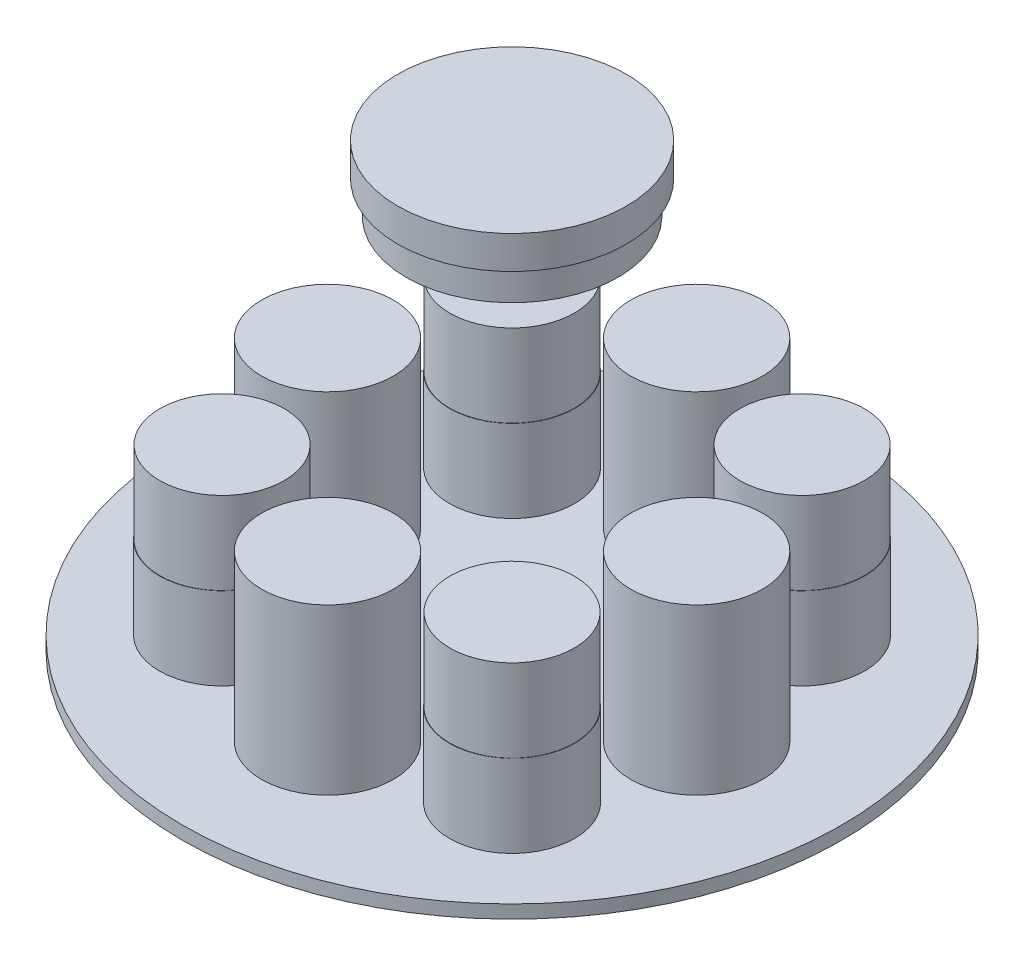
ISO-10303-21;
HEADER;
FILE_DESCRIPTION(('STEP AP214'),'2;1');
FILE_NAME('part.step','',(''),(''),'','','');
FILE_SCHEMA(('AUTOMOTIVE_DESIGN { 1 0 10303 214 1 1 1 1 }'));
ENDSEC;
DATA;
#1=APPLICATION_CONTEXT('core data for automotive mechanical design processes');
#2=APPLICATION_PROTOCOL_DEFINITION('international standard','automotive_design',2000,#1);
#3=PRODUCT_CONTEXT('',#1,'mechanical');
#4=PRODUCT('Part','Part','',(#3));
#5=PRODUCT_RELATED_PRODUCT_CATEGORY('part','',(#4));
#6=PRODUCT_DEFINITION_FORMATION('','',#4);
#7=PRODUCT_DEFINITION_CONTEXT('part definition',#1,'design');
#8=PRODUCT_DEFINITION('design','',#6,#7);
#9=PRODUCT_DEFINITION_SHAPE('','',#8);
#10=(LENGTH_UNIT() NAMED_UNIT(*) SI_UNIT(.MILLI.,.METRE.));
#11=(NAMED_UNIT(*) PLANE_ANGLE_UNIT() SI_UNIT($,.RADIAN.));
#12=(NAMED_UNIT(*) SI_UNIT($,.STERADIAN.) SOLID_ANGLE_UNIT());
#13=UNCERTAINTY_MEASURE_WITH_UNIT(LENGTH_MEASURE(1.E-05),#10,'distance_accuracy_value','');
#14=(GEOMETRIC_REPRESENTATION_CONTEXT(3) GLOBAL_UNCERTAINTY_ASSIGNED_CONTEXT((#13)) GLOBAL_UNIT_ASSIGNED_CONTEXT((#10,
#11,#12)) REPRESENTATION_CONTEXT('',''));
#15=CARTESIAN_POINT('',(0.,0.,0.));
#16=DIRECTION('',(0.,0.,1.));
#17=DIRECTION('',(1.,0.,0.));
#18=AXIS2_PLACEMENT_3D('',#15,#16,#17);
#19=CARTESIAN_POINT('',(0.,62.,0.));
#20=DIRECTION('',(0.,-1.,0.));
#21=DIRECTION('',(0.,0.,-1.));
#22=AXIS2_PLACEMENT_3D('',#19,#20,#21);
#23=CYLINDRICAL_SURFACE('',#22,16.0713294630124);
#24=CARTESIAN_POINT('',(0.,62.,0.));
#25=DIRECTION('',(0.,1.,0.));
#26=DIRECTION('',(0.,0.,1.));
#27=AXIS2_PLACEMENT_3D('',#24,#25,#26);
#28=CIRCLE('',#27,16.0713294630124);
#29=CARTESIAN_POINT('',(0.,62.,16.0713294630124));
#30=VERTEX_POINT('',#29);
#31=EDGE_CURVE('E11',#30,#30,#28,.T.);
#32=ORIENTED_EDGE('',*,*,#31,.F.);
#33=EDGE_LOOP('',(#32));
#34=FACE_BOUND('',#33,.T.);
#35=CARTESIAN_POINT('',(0.,57.,0.));
#36=DIRECTION('',(0.,1.,0.));
#37=DIRECTION('',(0.,0.,1.));
#38=AXIS2_PLACEMENT_3D('',#35,#36,#37);
#39=CIRCLE('',#38,16.0713294630124);
#40=CARTESIAN_POINT('',(0.,57.,16.0713294630124));
#41=VERTEX_POINT('',#40);
#42=EDGE_CURVE('E47',#41,#41,#39,.T.);
#43=ORIENTED_EDGE('',*,*,#42,.T.);
#44=EDGE_LOOP('',(#43));
#45=FACE_BOUND('',#44,.T.);
#46=ADVANCED_FACE('F44',(#34,#45),#23,.T.);
#47=CARTESIAN_POINT('',(0.,57.,0.));
#48=DIRECTION('',(0.,1.,0.));
#49=DIRECTION('',(0.,0.,1.));
#50=AXIS2_PLACEMENT_3D('',#47,#48,#49);
#51=PLANE('',#50);
#52=ORIENTED_EDGE('',*,*,#42,.F.);
#53=EDGE_LOOP('',(#52));
#54=FACE_BOUND('',#53,.T.);
#55=ADVANCED_FACE('F67',(#54),#51,.F.);
#56=CARTESIAN_POINT('',(0.,67.,0.));
#57=DIRECTION('',(0.,-1.,0.));
#58=DIRECTION('',(0.,0.,-1.));
#59=AXIS2_PLACEMENT_3D('',#56,#57,#58);
#60=CYLINDRICAL_SURFACE('',#59,17.3454121764455);
#61=CARTESIAN_POINT('',(0.,67.,0.));
#62=DIRECTION('',(0.,1.,0.));
#63=DIRECTION('',(0.,0.,1.));
#64=AXIS2_PLACEMENT_3D('',#61,#62,#63);
#65=CIRCLE('',#64,17.3454121764455);
#66=CARTESIAN_POINT('',(0.,67.,17.3454121764455));
#67=VERTEX_POINT('',#66);
#68=EDGE_CURVE('E54',#67,#67,#65,.T.);
#69=ORIENTED_EDGE('',*,*,#68,.F.);
#70=EDGE_LOOP('',(#69));
#71=FACE_BOUND('',#70,.T.);
#72=CARTESIAN_POINT('',(0.,62.,0.));
#73=DIRECTION('',(0.,1.,0.));
#74=DIRECTION('',(0.,0.,1.));
#75=AXIS2_PLACEMENT_3D('',#72,#73,#74);
#76=CIRCLE('',#75,17.3454121764455);
#77=CARTESIAN_POINT('',(0.,62.,17.3454121764455));
#78=VERTEX_POINT('',#77);
#79=EDGE_CURVE('E56',#78,#78,#76,.T.);
#80=ORIENTED_EDGE('',*,*,#79,.T.);
#81=EDGE_LOOP('',(#80));
#82=FACE_BOUND('',#81,.T.);
#83=ADVANCED_FACE('F64',(#71,#82),#60,.T.);
#84=CARTESIAN_POINT('',(0.,67.,0.));
#85=DIRECTION('',(0.,1.,0.));
#86=DIRECTION('',(0.,0.,1.));
#87=AXIS2_PLACEMENT_3D('',#84,#85,#86);
#88=PLANE('',#87);
#89=ORIENTED_EDGE('',*,*,#68,.T.);
#90=EDGE_LOOP('',(#89));
#91=FACE_BOUND('',#90,.T.);
#92=ADVANCED_FACE('F62',(#91),#88,.T.);
#93=CARTESIAN_POINT('',(0.,62.,0.));
#94=DIRECTION('',(0.,1.,0.));
#95=DIRECTION('',(0.,0.,1.));
#96=AXIS2_PLACEMENT_3D('',#93,#94,#95);
#97=PLANE('',#96);
#98=ORIENTED_EDGE('',*,*,#31,.T.);
#99=EDGE_LOOP('',(#98));
#100=FACE_BOUND('',#99,.T.);
#101=ORIENTED_EDGE('',*,*,#79,.F.);
#102=EDGE_LOOP('',(#101));
#103=FACE_BOUND('',#102,.T.);
#104=ADVANCED_FACE('F71',(#100,#103),#97,.F.);
#105=CLOSED_SHELL('',(#46,#55,#83,#92,#104));
#106=MANIFOLD_SOLID_BREP('B2',#105);
#107=CARTESIAN_POINT('',(0.,2.,0.));
#108=DIRECTION('',(0.,-1.,0.));
#109=DIRECTION('',(0.,0.,-1.));
#110=AXIS2_PLACEMENT_3D('',#107,#108,#109);
#111=CYLINDRICAL_SURFACE('',#110,50.);
#112=CARTESIAN_POINT('',(0.,2.,0.));
#113=DIRECTION('',(0.,1.,0.));
#114=DIRECTION('',(0.,0.,1.));
#115=AXIS2_PLACEMENT_3D('',#112,#113,#114);
#116=CIRCLE('',#115,50.);
#117=CARTESIAN_POINT('',(0.,2.,50.));
#118=VERTEX_POINT('',#117);
#119=EDGE_CURVE('E188',#118,#118,#116,.T.);
#120=ORIENTED_EDGE('',*,*,#119,.F.);
#121=EDGE_LOOP('',(#120));
#122=FACE_BOUND('',#121,.T.);
#123=CARTESIAN_POINT('',(0.,0.,0.));
#124=DIRECTION('',(0.,1.,0.));
#125=DIRECTION('',(0.,0.,1.));
#126=AXIS2_PLACEMENT_3D('',#123,#124,#125);
#127=CIRCLE('',#126,50.);
#128=CARTESIAN_POINT('',(0.,0.,50.));
#129=VERTEX_POINT('',#128);
#130=EDGE_CURVE('E185',#129,#129,#127,.T.);
#131=ORIENTED_EDGE('',*,*,#130,.T.);
#132=EDGE_LOOP('',(#131));
#133=FACE_BOUND('',#132,.T.);
#134=ADVANCED_FACE('F114',(#122,#133),#111,.T.);
#135=CARTESIAN_POINT('',(0.,2.,0.));
#136=DIRECTION('',(0.,1.,0.));
#137=DIRECTION('',(0.,0.,1.));
#138=AXIS2_PLACEMENT_3D('',#135,#136,#137);
#139=PLANE('',#138);
#140=CARTESIAN_POINT('',(-22.,2.,22.));
#141=DIRECTION('',(0.,1.,0.));
#142=DIRECTION('',(0.,0.,1.));
#143=AXIS2_PLACEMENT_3D('',#140,#141,#142);
#144=CIRCLE('',#143,9.5);
#145=CARTESIAN_POINT('',(-22.,2.,31.5));
#146=VERTEX_POINT('',#145);
#147=EDGE_CURVE('E143',#146,#146,#144,.T.);
#148=ORIENTED_EDGE('',*,*,#147,.F.);
#149=EDGE_LOOP('',(#148));
#150=FACE_BOUND('',#149,.T.);
#151=CARTESIAN_POINT('',(-22.,2.,-22.));
#152=DIRECTION('',(0.,1.,0.));
#153=DIRECTION('',(0.,0.,1.));
#154=AXIS2_PLACEMENT_3D('',#151,#152,#153);
#155=CIRCLE('',#154,9.5);
#156=CARTESIAN_POINT('',(-22.,2.,-12.5));
#157=VERTEX_POINT('',#156);
#158=EDGE_CURVE('E117',#157,#157,#155,.T.);
#159=ORIENTED_EDGE('',*,*,#158,.F.);
#160=EDGE_LOOP('',(#159));
#161=FACE_BOUND('',#160,.T.);
#162=CARTESIAN_POINT('',(22.,2.,-22.));
#163=DIRECTION('',(0.,1.,0.));
#164=DIRECTION('',(0.,0.,1.));
#165=AXIS2_PLACEMENT_3D('',#162,#163,#164);
#166=CIRCLE('',#165,9.5);
#167=CARTESIAN_POINT('',(22.,2.,-12.5));
#168=VERTEX_POINT('',#167);
#169=EDGE_CURVE('E191',#168,#168,#166,.T.);
#170=ORIENTED_EDGE('',*,*,#169,.F.);
#171=EDGE_LOOP('',(#170));
#172=FACE_BOUND('',#171,.T.);
#173=CARTESIAN_POINT('',(22.,2.,22.));
#174=DIRECTION('',(0.,1.,0.));
#175=DIRECTION('',(0.,0.,1.));
#176=AXIS2_PLACEMENT_3D('',#173,#174,#175);
#177=CIRCLE('',#176,9.5);
#178=CARTESIAN_POINT('',(22.,2.,31.5));
#179=VERTEX_POINT('',#178);
#180=EDGE_CURVE('E157',#179,#179,#177,.T.);
#181=ORIENTED_EDGE('',*,*,#180,.F.);
#182=EDGE_LOOP('',(#181));
#183=FACE_BOUND('',#182,.T.);
#184=CARTESIAN_POINT('',(-28.,2.,0.));
#185=DIRECTION('',(0.,1.,0.));
#186=DIRECTION('',(0.,0.,1.));
#187=AXIS2_PLACEMENT_3D('',#184,#185,#186);
#188=CIRCLE('',#187,10.);
#189=CARTESIAN_POINT('',(-28.,2.,10.));
#190=VERTEX_POINT('',#189);
#191=EDGE_CURVE('E161',#190,#190,#188,.T.);
#192=ORIENTED_EDGE('',*,*,#191,.F.);
#193=EDGE_LOOP('',(#192));
#194=FACE_BOUND('',#193,.T.);
#195=CARTESIAN_POINT('',(0.,2.,28.));
#196=DIRECTION('',(0.,1.,0.));
#197=DIRECTION('',(0.,0.,1.));
#198=AXIS2_PLACEMENT_3D('',#195,#196,#197);
#199=CIRCLE('',#198,10.);
#200=CARTESIAN_POINT('',(0.,2.,38.));
#201=VERTEX_POINT('',#200);
#202=EDGE_CURVE('E167',#201,#201,#199,.T.);
#203=ORIENTED_EDGE('',*,*,#202,.F.);
#204=EDGE_LOOP('',(#203));
#205=FACE_BOUND('',#204,.T.);
#206=CARTESIAN_POINT('',(28.,2.,0.));
#207=DIRECTION('',(0.,1.,0.));
#208=DIRECTION('',(0.,0.,1.));
#209=AXIS2_PLACEMENT_3D('',#206,#207,#208);
#210=CIRCLE('',#209,10.);
#211=CARTESIAN_POINT('',(28.,2.,10.));
#212=VERTEX_POINT('',#211);
#213=EDGE_CURVE('E173',#212,#212,#210,.T.);
#214=ORIENTED_EDGE('',*,*,#213,.F.);
#215=EDGE_LOOP('',(#214));
#216=FACE_BOUND('',#215,.T.);
#217=CARTESIAN_POINT('',(0.,2.,-28.));
#218=DIRECTION('',(0.,1.,0.));
#219=DIRECTION('',(0.,0.,1.));
#220=AXIS2_PLACEMENT_3D('',#217,#218,#219);
#221=CIRCLE('',#220,10.);
#222=CARTESIAN_POINT('',(0.,2.,-18.));
#223=VERTEX_POINT('',#222);
#224=EDGE_CURVE('E179',#223,#223,#221,.T.);
#225=ORIENTED_EDGE('',*,*,#224,.F.);
#226=EDGE_LOOP('',(#225));
#227=FACE_BOUND('',#226,.T.);
#228=ORIENTED_EDGE('',*,*,#119,.T.);
#229=EDGE_LOOP('',(#228));
#230=FACE_BOUND('',#229,.T.);
#231=ADVANCED_FACE('F201',(#150,#161,#172,#183,#194,#205,#216,#227,#230),#139,.T.);
#232=CARTESIAN_POINT('',(0.,0.,0.));
#233=DIRECTION('',(0.,1.,0.));
#234=DIRECTION('',(0.,0.,1.));
#235=AXIS2_PLACEMENT_3D('',#232,#233,#234);
#236=PLANE('',#235);
#237=ORIENTED_EDGE('',*,*,#130,.F.);
#238=EDGE_LOOP('',(#237));
#239=FACE_BOUND('',#238,.T.);
#240=ADVANCED_FACE('F204',(#239),#236,.F.);
#241=CARTESIAN_POINT('',(0.,27.,-28.));
#242=DIRECTION('',(0.,-1.,0.));
#243=DIRECTION('',(0.,0.,-1.));
#244=AXIS2_PLACEMENT_3D('',#241,#242,#243);
#245=CYLINDRICAL_SURFACE('',#244,10.);
#246=CARTESIAN_POINT('',(0.,27.,-28.));
#247=DIRECTION('',(0.,1.,0.));
#248=DIRECTION('',(0.,0.,1.));
#249=AXIS2_PLACEMENT_3D('',#246,#247,#248);
#250=CIRCLE('',#249,10.);
#251=CARTESIAN_POINT('',(0.,27.,-18.));
#252=VERTEX_POINT('',#251);
#253=EDGE_CURVE('E182',#252,#252,#250,.T.);
#254=ORIENTED_EDGE('',*,*,#253,.F.);
#255=EDGE_LOOP('',(#254));
#256=FACE_BOUND('',#255,.T.);
#257=ORIENTED_EDGE('',*,*,#224,.T.);
#258=EDGE_LOOP('',(#257));
#259=FACE_BOUND('',#258,.T.);
#260=ADVANCED_FACE('F225',(#256,#259),#245,.T.);
#261=CARTESIAN_POINT('',(0.,27.,0.));
#262=DIRECTION('',(0.,1.,0.));
#263=DIRECTION('',(0.,0.,1.));
#264=AXIS2_PLACEMENT_3D('',#261,#262,#263);
#265=PLANE('',#264);
#266=ORIENTED_EDGE('',*,*,#253,.T.);
#267=EDGE_LOOP('',(#266));
#268=FACE_BOUND('',#267,.T.);
#269=ADVANCED_FACE('F229',(#268),#265,.T.);
#270=CARTESIAN_POINT('',(28.,27.,0.));
#271=DIRECTION('',(0.,-1.,0.));
#272=DIRECTION('',(0.,0.,-1.));
#273=AXIS2_PLACEMENT_3D('',#270,#271,#272);
#274=CYLINDRICAL_SURFACE('',#273,10.);
#275=CARTESIAN_POINT('',(28.,27.,0.));
#276=DIRECTION('',(0.,1.,0.));
#277=DIRECTION('',(0.,0.,1.));
#278=AXIS2_PLACEMENT_3D('',#275,#276,#277);
#279=CIRCLE('',#278,10.);
#280=CARTESIAN_POINT('',(28.,27.,10.));
#281=VERTEX_POINT('',#280);
#282=EDGE_CURVE('E176',#281,#281,#279,.T.);
#283=ORIENTED_EDGE('',*,*,#282,.F.);
#284=EDGE_LOOP('',(#283));
#285=FACE_BOUND('',#284,.T.);
#286=ORIENTED_EDGE('',*,*,#213,.T.);
#287=EDGE_LOOP('',(#286));
#288=FACE_BOUND('',#287,.T.);
#289=ADVANCED_FACE('F235',(#285,#288),#274,.T.);
#290=CARTESIAN_POINT('',(0.,27.,0.));
#291=DIRECTION('',(0.,1.,0.));
#292=DIRECTION('',(0.,0.,1.));
#293=AXIS2_PLACEMENT_3D('',#290,#291,#292);
#294=PLANE('',#293);
#295=ORIENTED_EDGE('',*,*,#282,.T.);
#296=EDGE_LOOP('',(#295));
#297=FACE_BOUND('',#296,.T.);
#298=ADVANCED_FACE('F239',(#297),#294,.T.);
#299=CARTESIAN_POINT('',(0.,27.,28.));
#300=DIRECTION('',(0.,-1.,0.));
#301=DIRECTION('',(0.,0.,-1.));
#302=AXIS2_PLACEMENT_3D('',#299,#300,#301);
#303=CYLINDRICAL_SURFACE('',#302,10.);
#304=CARTESIAN_POINT('',(0.,27.,28.));
#305=DIRECTION('',(0.,1.,0.));
#306=DIRECTION('',(0.,0.,1.));
#307=AXIS2_PLACEMENT_3D('',#304,#305,#306);
#308=CIRCLE('',#307,10.);
#309=CARTESIAN_POINT('',(0.,27.,38.));
#310=VERTEX_POINT('',#309);
#311=EDGE_CURVE('E170',#310,#310,#308,.T.);
#312=ORIENTED_EDGE('',*,*,#311,.F.);
#313=EDGE_LOOP('',(#312));
#314=FACE_BOUND('',#313,.T.);
#315=ORIENTED_EDGE('',*,*,#202,.T.);
#316=EDGE_LOOP('',(#315));
#317=FACE_BOUND('',#316,.T.);
#318=ADVANCED_FACE('F243',(#314,#317),#303,.T.);
#319=CARTESIAN_POINT('',(0.,27.,0.));
#320=DIRECTION('',(0.,1.,0.));
#321=DIRECTION('',(0.,0.,1.));
#322=AXIS2_PLACEMENT_3D('',#319,#320,#321);
#323=PLANE('',#322);
#324=ORIENTED_EDGE('',*,*,#311,.T.);
#325=EDGE_LOOP('',(#324));
#326=FACE_BOUND('',#325,.T.);
#327=ADVANCED_FACE('F247',(#326),#323,.T.);
#328=CARTESIAN_POINT('',(-28.,27.,0.));
#329=DIRECTION('',(0.,-1.,0.));
#330=DIRECTION('',(0.,0.,-1.));
#331=AXIS2_PLACEMENT_3D('',#328,#329,#330);
#332=CYLINDRICAL_SURFACE('',#331,10.);
#333=CARTESIAN_POINT('',(-28.,27.,0.));
#334=DIRECTION('',(0.,1.,0.));
#335=DIRECTION('',(0.,0.,1.));
#336=AXIS2_PLACEMENT_3D('',#333,#334,#335);
#337=CIRCLE('',#336,10.);
#338=CARTESIAN_POINT('',(-28.,27.,10.));
#339=VERTEX_POINT('',#338);
#340=EDGE_CURVE('E164',#339,#339,#337,.T.);
#341=ORIENTED_EDGE('',*,*,#340,.F.);
#342=EDGE_LOOP('',(#341));
#343=FACE_BOUND('',#342,.T.);
#344=ORIENTED_EDGE('',*,*,#191,.T.);
#345=EDGE_LOOP('',(#344));
#346=FACE_BOUND('',#345,.T.);
#347=ADVANCED_FACE('F251',(#343,#346),#332,.T.);
#348=CARTESIAN_POINT('',(0.,27.,0.));
#349=DIRECTION('',(0.,1.,0.));
#350=DIRECTION('',(0.,0.,1.));
#351=AXIS2_PLACEMENT_3D('',#348,#349,#350);
#352=PLANE('',#351);
#353=ORIENTED_EDGE('',*,*,#340,.T.);
#354=EDGE_LOOP('',(#353));
#355=FACE_BOUND('',#354,.T.);
#356=ADVANCED_FACE('F255',(#355),#352,.T.);
#357=CARTESIAN_POINT('',(22.,14.5,22.));
#358=DIRECTION('',(0.,-1.,0.));
#359=DIRECTION('',(0.,0.,-1.));
#360=AXIS2_PLACEMENT_3D('',#357,#358,#359);
#361=CYLINDRICAL_SURFACE('',#360,9.5);
#362=CARTESIAN_POINT('',(22.,14.5,22.));
#363=DIRECTION('',(0.,1.,0.));
#364=DIRECTION('',(0.,0.,1.));
#365=AXIS2_PLACEMENT_3D('',#362,#363,#364);
#366=CIRCLE('',#365,9.5);
#367=CARTESIAN_POINT('',(22.,14.5,31.5));
#368=VERTEX_POINT('',#367);
#369=EDGE_CURVE('E158',#368,#368,#366,.T.);
#370=ORIENTED_EDGE('',*,*,#369,.F.);
#371=EDGE_LOOP('',(#370));
#372=FACE_BOUND('',#371,.T.);
#373=ORIENTED_EDGE('',*,*,#180,.T.);
#374=EDGE_LOOP('',(#373));
#375=FACE_BOUND('',#374,.T.);
#376=ADVANCED_FACE('F259',(#372,#375),#361,.T.);
#377=CARTESIAN_POINT('',(0.,14.5,0.));
#378=DIRECTION('',(0.,1.,0.));
#379=DIRECTION('',(0.,0.,1.));
#380=AXIS2_PLACEMENT_3D('',#377,#378,#379);
#381=PLANE('',#380);
#382=CARTESIAN_POINT('',(22.,14.5,22.));
#383=DIRECTION('',(0.,1.,0.));
#384=DIRECTION('',(0.,0.,1.));
#385=AXIS2_PLACEMENT_3D('',#382,#383,#384);
#386=CIRCLE('',#385,9.45);
#387=CARTESIAN_POINT('',(22.,14.5,31.45));
#388=VERTEX_POINT('',#387);
#389=EDGE_CURVE('E121',#388,#388,#386,.T.);
#390=ORIENTED_EDGE('',*,*,#389,.F.);
#391=EDGE_LOOP('',(#390));
#392=FACE_BOUND('',#391,.T.);
#393=ORIENTED_EDGE('',*,*,#369,.T.);
#394=EDGE_LOOP('',(#393));
#395=FACE_BOUND('',#394,.T.);
#396=ADVANCED_FACE('F263',(#392,#395),#381,.T.);
#397=CARTESIAN_POINT('',(22.,14.5,-22.));
#398=DIRECTION('',(0.,-1.,0.));
#399=DIRECTION('',(0.,0.,-1.));
#400=AXIS2_PLACEMENT_3D('',#397,#398,#399);
#401=CYLINDRICAL_SURFACE('',#400,9.5);
#402=CARTESIAN_POINT('',(22.,14.5,-22.));
#403=DIRECTION('',(0.,1.,0.));
#404=DIRECTION('',(0.,0.,1.));
#405=AXIS2_PLACEMENT_3D('',#402,#403,#404);
#406=CIRCLE('',#405,9.5);
#407=CARTESIAN_POINT('',(22.,14.5,-12.5));
#408=VERTEX_POINT('',#407);
#409=EDGE_CURVE('E154',#408,#408,#406,.F.);
#410=ORIENTED_EDGE('',*,*,#409,.T.);
#411=EDGE_LOOP('',(#410));
#412=FACE_BOUND('',#411,.T.);
#413=ORIENTED_EDGE('',*,*,#169,.T.);
#414=EDGE_LOOP('',(#413));
#415=FACE_BOUND('',#414,.T.);
#416=ADVANCED_FACE('F267',(#412,#415),#401,.T.);
#417=CARTESIAN_POINT('',(0.,14.5,0.));
#418=DIRECTION('',(0.,1.,0.));
#419=DIRECTION('',(0.,0.,1.));
#420=AXIS2_PLACEMENT_3D('',#417,#418,#419);
#421=PLANE('',#420);
#422=CARTESIAN_POINT('',(22.,14.5,-22.));
#423=DIRECTION('',(0.,1.,0.));
#424=DIRECTION('',(0.,0.,1.));
#425=AXIS2_PLACEMENT_3D('',#422,#423,#424);
#426=CIRCLE('',#425,9.45);
#427=CARTESIAN_POINT('',(22.,14.5,-12.55));
#428=VERTEX_POINT('',#427);
#429=EDGE_CURVE('E126',#428,#428,#426,.T.);
#430=ORIENTED_EDGE('',*,*,#429,.F.);
#431=EDGE_LOOP('',(#430));
#432=FACE_BOUND('',#431,.T.);
#433=ORIENTED_EDGE('',*,*,#409,.F.);
#434=EDGE_LOOP('',(#433));
#435=FACE_BOUND('',#434,.T.);
#436=ADVANCED_FACE('F271',(#432,#435),#421,.T.);
#437=CARTESIAN_POINT('',(-22.,14.5,-22.));
#438=DIRECTION('',(0.,-1.,0.));
#439=DIRECTION('',(0.,0.,-1.));
#440=AXIS2_PLACEMENT_3D('',#437,#438,#439);
#441=CYLINDRICAL_SURFACE('',#440,9.5);
#442=CARTESIAN_POINT('',(-22.,14.5,-22.));
#443=DIRECTION('',(0.,1.,0.));
#444=DIRECTION('',(0.,0.,1.));
#445=AXIS2_PLACEMENT_3D('',#442,#443,#444);
#446=CIRCLE('',#445,9.5);
#447=CARTESIAN_POINT('',(-22.,14.5,-12.5));
#448=VERTEX_POINT('',#447);
#449=EDGE_CURVE('E149',#448,#448,#446,.F.);
#450=ORIENTED_EDGE('',*,*,#449,.T.);
#451=EDGE_LOOP('',(#450));
#452=FACE_BOUND('',#451,.T.);
#453=ORIENTED_EDGE('',*,*,#158,.T.);
#454=EDGE_LOOP('',(#453));
#455=FACE_BOUND('',#454,.T.);
#456=ADVANCED_FACE('F199',(#452,#455),#441,.T.);
#457=CARTESIAN_POINT('',(0.,14.5,0.));
#458=DIRECTION('',(0.,1.,0.));
#459=DIRECTION('',(0.,0.,1.));
#460=AXIS2_PLACEMENT_3D('',#457,#458,#459);
#461=PLANE('',#460);
#462=CARTESIAN_POINT('',(-22.,14.5,-22.));
#463=DIRECTION('',(0.,1.,0.));
#464=DIRECTION('',(0.,0.,1.));
#465=AXIS2_PLACEMENT_3D('',#462,#463,#464);
#466=CIRCLE('',#465,9.45);
#467=CARTESIAN_POINT('',(-22.,14.5,-12.55));
#468=VERTEX_POINT('',#467);
#469=EDGE_CURVE('E43',#468,#468,#466,.T.);
#470=ORIENTED_EDGE('',*,*,#469,.F.);
#471=EDGE_LOOP('',(#470));
#472=FACE_BOUND('',#471,.T.);
#473=ORIENTED_EDGE('',*,*,#449,.F.);
#474=EDGE_LOOP('',(#473));
#475=FACE_BOUND('',#474,.T.);
#476=ADVANCED_FACE('F278',(#472,#475),#461,.T.);
#477=CARTESIAN_POINT('',(-22.,14.5,22.));
#478=DIRECTION('',(0.,-1.,0.));
#479=DIRECTION('',(0.,0.,-1.));
#480=AXIS2_PLACEMENT_3D('',#477,#478,#479);
#481=CYLINDRICAL_SURFACE('',#480,9.5);
#482=CARTESIAN_POINT('',(-22.,14.5,22.));
#483=DIRECTION('',(0.,1.,0.));
#484=DIRECTION('',(0.,0.,1.));
#485=AXIS2_PLACEMENT_3D('',#482,#483,#484);
#486=CIRCLE('',#485,9.5);
#487=CARTESIAN_POINT('',(-22.,14.5,31.5));
#488=VERTEX_POINT('',#487);
#489=EDGE_CURVE('E146',#488,#488,#486,.T.);
#490=ORIENTED_EDGE('',*,*,#489,.F.);
#491=EDGE_LOOP('',(#490));
#492=FACE_BOUND('',#491,.T.);
#493=ORIENTED_EDGE('',*,*,#147,.T.);
#494=EDGE_LOOP('',(#493));
#495=FACE_BOUND('',#494,.T.);
#496=ADVANCED_FACE('F282',(#492,#495),#481,.T.);
#497=CARTESIAN_POINT('',(0.,14.5,0.));
#498=DIRECTION('',(0.,1.,0.));
#499=DIRECTION('',(0.,0.,1.));
#500=AXIS2_PLACEMENT_3D('',#497,#498,#499);
#501=PLANE('',#500);
#502=CARTESIAN_POINT('',(-22.,14.5,22.));
#503=DIRECTION('',(0.,1.,0.));
#504=DIRECTION('',(0.,0.,1.));
#505=AXIS2_PLACEMENT_3D('',#502,#503,#504);
#506=CIRCLE('',#505,9.45);
#507=CARTESIAN_POINT('',(-22.,14.5,31.45));
#508=VERTEX_POINT('',#507);
#509=EDGE_CURVE('E140',#508,#508,#506,.T.);
#510=ORIENTED_EDGE('',*,*,#509,.F.);
#511=EDGE_LOOP('',(#510));
#512=FACE_BOUND('',#511,.T.);
#513=ORIENTED_EDGE('',*,*,#489,.T.);
#514=EDGE_LOOP('',(#513));
#515=FACE_BOUND('',#514,.T.);
#516=ADVANCED_FACE('F286',(#512,#515),#501,.T.);
#517=CARTESIAN_POINT('',(-22.,27.,22.));
#518=DIRECTION('',(0.,-1.,0.));
#519=DIRECTION('',(0.,0.,-1.));
#520=AXIS2_PLACEMENT_3D('',#517,#518,#519);
#521=CYLINDRICAL_SURFACE('',#520,9.45);
#522=CARTESIAN_POINT('',(-22.,27.,22.));
#523=DIRECTION('',(0.,1.,0.));
#524=DIRECTION('',(0.,0.,1.));
#525=AXIS2_PLACEMENT_3D('',#522,#523,#524);
#526=CIRCLE('',#525,9.45);
#527=CARTESIAN_POINT('',(-22.,27.,31.45));
#528=VERTEX_POINT('',#527);
#529=EDGE_CURVE('E137',#528,#528,#526,.T.);
#530=ORIENTED_EDGE('',*,*,#529,.F.);
#531=EDGE_LOOP('',(#530));
#532=FACE_BOUND('',#531,.T.);
#533=ORIENTED_EDGE('',*,*,#509,.T.);
#534=EDGE_LOOP('',(#533));
#535=FACE_BOUND('',#534,.T.);
#536=ADVANCED_FACE('F290',(#532,#535),#521,.T.);
#537=CARTESIAN_POINT('',(-22.,27.,22.));
#538=DIRECTION('',(0.,1.,0.));
#539=DIRECTION('',(0.,0.,1.));
#540=AXIS2_PLACEMENT_3D('',#537,#538,#539);
#541=PLANE('',#540);
#542=ORIENTED_EDGE('',*,*,#529,.T.);
#543=EDGE_LOOP('',(#542));
#544=FACE_BOUND('',#543,.T.);
#545=ADVANCED_FACE('F294',(#544),#541,.T.);
#546=CARTESIAN_POINT('',(22.,27.,-22.));
#547=DIRECTION('',(0.,-1.,0.));
#548=DIRECTION('',(0.,0.,-1.));
#549=AXIS2_PLACEMENT_3D('',#546,#547,#548);
#550=CYLINDRICAL_SURFACE('',#549,9.45);
#551=CARTESIAN_POINT('',(22.,27.,-22.));
#552=DIRECTION('',(0.,1.,0.));
#553=DIRECTION('',(0.,0.,1.));
#554=AXIS2_PLACEMENT_3D('',#551,#552,#553);
#555=CIRCLE('',#554,9.45);
#556=CARTESIAN_POINT('',(22.,27.,-12.55));
#557=VERTEX_POINT('',#556);
#558=EDGE_CURVE('E133',#557,#557,#555,.T.);
#559=ORIENTED_EDGE('',*,*,#558,.F.);
#560=EDGE_LOOP('',(#559));
#561=FACE_BOUND('',#560,.T.);
#562=ORIENTED_EDGE('',*,*,#429,.T.);
#563=EDGE_LOOP('',(#562));
#564=FACE_BOUND('',#563,.T.);
#565=ADVANCED_FACE('F298',(#561,#564),#550,.T.);
#566=CARTESIAN_POINT('',(22.,27.,-22.));
#567=DIRECTION('',(0.,1.,0.));
#568=DIRECTION('',(0.,0.,1.));
#569=AXIS2_PLACEMENT_3D('',#566,#567,#568);
#570=PLANE('',#569);
#571=ORIENTED_EDGE('',*,*,#558,.T.);
#572=EDGE_LOOP('',(#571));
#573=FACE_BOUND('',#572,.T.);
#574=ADVANCED_FACE('F302',(#573),#570,.T.);
#575=CARTESIAN_POINT('',(22.,27.,22.));
#576=DIRECTION('',(0.,-1.,0.));
#577=DIRECTION('',(0.,0.,-1.));
#578=AXIS2_PLACEMENT_3D('',#575,#576,#577);
#579=CYLINDRICAL_SURFACE('',#578,9.45);
#580=CARTESIAN_POINT('',(22.,27.,22.));
#581=DIRECTION('',(0.,1.,0.));
#582=DIRECTION('',(0.,0.,1.));
#583=AXIS2_PLACEMENT_3D('',#580,#581,#582);
#584=CIRCLE('',#583,9.45);
#585=CARTESIAN_POINT('',(22.,27.,31.45));
#586=VERTEX_POINT('',#585);
#587=EDGE_CURVE('E131',#586,#586,#584,.T.);
#588=ORIENTED_EDGE('',*,*,#587,.F.);
#589=EDGE_LOOP('',(#588));
#590=FACE_BOUND('',#589,.T.);
#591=ORIENTED_EDGE('',*,*,#389,.T.);
#592=EDGE_LOOP('',(#591));
#593=FACE_BOUND('',#592,.T.);
#594=ADVANCED_FACE('F306',(#590,#593),#579,.T.);
#595=CARTESIAN_POINT('',(22.,27.,22.));
#596=DIRECTION('',(0.,1.,0.));
#597=DIRECTION('',(0.,0.,1.));
#598=AXIS2_PLACEMENT_3D('',#595,#596,#597);
#599=PLANE('',#598);
#600=ORIENTED_EDGE('',*,*,#587,.T.);
#601=EDGE_LOOP('',(#600));
#602=FACE_BOUND('',#601,.T.);
#603=ADVANCED_FACE('F310',(#602),#599,.T.);
#604=CARTESIAN_POINT('',(-22.,27.,-22.));
#605=DIRECTION('',(0.,-1.,0.));
#606=DIRECTION('',(0.,0.,-1.));
#607=AXIS2_PLACEMENT_3D('',#604,#605,#606);
#608=CYLINDRICAL_SURFACE('',#607,9.45);
#609=CARTESIAN_POINT('',(-22.,27.,-22.));
#610=DIRECTION('',(0.,1.,0.));
#611=DIRECTION('',(0.,0.,1.));
#612=AXIS2_PLACEMENT_3D('',#609,#610,#611);
#613=CIRCLE('',#612,9.45);
#614=CARTESIAN_POINT('',(-22.,27.,-12.55));
#615=VERTEX_POINT('',#614);
#616=EDGE_CURVE('E130',#615,#615,#613,.T.);
#617=ORIENTED_EDGE('',*,*,#616,.F.);
#618=EDGE_LOOP('',(#617));
#619=FACE_BOUND('',#618,.T.);
#620=ORIENTED_EDGE('',*,*,#469,.T.);
#621=EDGE_LOOP('',(#620));
#622=FACE_BOUND('',#621,.T.);
#623=ADVANCED_FACE('F314',(#619,#622),#608,.T.);
#624=CARTESIAN_POINT('',(-22.,27.,-22.));
#625=DIRECTION('',(0.,1.,0.));
#626=DIRECTION('',(0.,0.,1.));
#627=AXIS2_PLACEMENT_3D('',#624,#625,#626);
#628=PLANE('',#627);
#629=ORIENTED_EDGE('',*,*,#616,.T.);
#630=EDGE_LOOP('',(#629));
#631=FACE_BOUND('',#630,.T.);
#632=ADVANCED_FACE('F318',(#631),#628,.T.);
#633=CLOSED_SHELL('',(#134,#231,#240,#260,#269,#289,#298,#318,#327,#347,#356,#376,#396,#416,
#436,#456,#476,#496,#516,#536,#545,#565,#574,#594,#603,#623,#632));
#634=MANIFOLD_SOLID_BREP('B6',#633);
#635=ADVANCED_BREP_SHAPE_REPRESENTATION('',(#18,#106,#634),#14);
#636=SHAPE_DEFINITION_REPRESENTATION(#9,#635);
ENDSEC;
END-ISO-10303-21;
